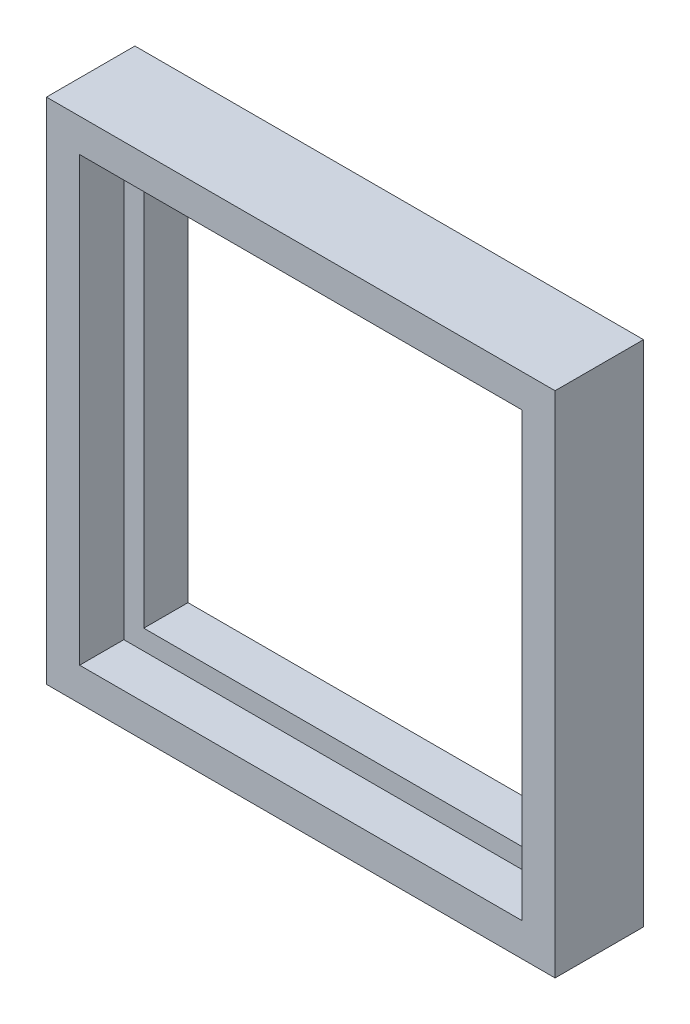
ISO-10303-21;
HEADER;
FILE_DESCRIPTION(('STEP AP214'),'2;1');
FILE_NAME('part.step','',(''),(''),'','','');
FILE_SCHEMA(('AUTOMOTIVE_DESIGN { 1 0 10303 214 1 1 1 1 }'));
ENDSEC;
DATA;
#1=APPLICATION_CONTEXT('core data for automotive mechanical design processes');
#2=APPLICATION_PROTOCOL_DEFINITION('international standard','automotive_design',2000,#1);
#3=PRODUCT_CONTEXT('',#1,'mechanical');
#4=PRODUCT('Part','Part','',(#3));
#5=PRODUCT_RELATED_PRODUCT_CATEGORY('part','',(#4));
#6=PRODUCT_DEFINITION_FORMATION('','',#4);
#7=PRODUCT_DEFINITION_CONTEXT('part definition',#1,'design');
#8=PRODUCT_DEFINITION('design','',#6,#7);
#9=PRODUCT_DEFINITION_SHAPE('','',#8);
#10=(LENGTH_UNIT() NAMED_UNIT(*) SI_UNIT(.MILLI.,.METRE.));
#11=(NAMED_UNIT(*) PLANE_ANGLE_UNIT() SI_UNIT($,.RADIAN.));
#12=(NAMED_UNIT(*) SI_UNIT($,.STERADIAN.) SOLID_ANGLE_UNIT());
#13=UNCERTAINTY_MEASURE_WITH_UNIT(LENGTH_MEASURE(1.E-05),#10,'distance_accuracy_value','');
#14=(GEOMETRIC_REPRESENTATION_CONTEXT(3) GLOBAL_UNCERTAINTY_ASSIGNED_CONTEXT((#13)) GLOBAL_UNIT_ASSIGNED_CONTEXT((#10,
#11,#12)) REPRESENTATION_CONTEXT('',''));
#15=CARTESIAN_POINT('',(0.,0.,0.));
#16=DIRECTION('',(0.,0.,1.));
#17=DIRECTION('',(1.,0.,0.));
#18=AXIS2_PLACEMENT_3D('',#15,#16,#17);
#19=CARTESIAN_POINT('',(0.,0.,1.));
#20=DIRECTION('',(0.,0.,-1.));
#21=DIRECTION('',(-1.,0.,0.));
#22=AXIS2_PLACEMENT_3D('',#19,#20,#21);
#23=PLANE('',#22);
#24=DIRECTION('',(0.,1.,0.));
#25=VECTOR('',#24,1.);
#26=CARTESIAN_POINT('',(5.75,-5.75,1.));
#27=LINE('',#26,#25);
#28=CARTESIAN_POINT('',(5.75,-5.75,1.));
#29=VERTEX_POINT('',#28);
#30=CARTESIAN_POINT('',(5.75,5.75,1.));
#31=VERTEX_POINT('',#30);
#32=EDGE_CURVE('E203',#29,#31,#27,.T.);
#33=ORIENTED_EDGE('',*,*,#32,.T.);
#34=DIRECTION('',(-1.,0.,0.));
#35=VECTOR('',#34,1.);
#36=CARTESIAN_POINT('',(-5.75,5.75,1.));
#37=LINE('',#36,#35);
#38=CARTESIAN_POINT('',(-5.75,5.75,1.));
#39=VERTEX_POINT('',#38);
#40=EDGE_CURVE('E206',#31,#39,#37,.T.);
#41=ORIENTED_EDGE('',*,*,#40,.T.);
#42=DIRECTION('',(0.,-1.,0.));
#43=VECTOR('',#42,1.);
#44=CARTESIAN_POINT('',(-5.75,-5.75,1.));
#45=LINE('',#44,#43);
#46=CARTESIAN_POINT('',(-5.75,-5.75,1.));
#47=VERTEX_POINT('',#46);
#48=EDGE_CURVE('E208',#39,#47,#45,.T.);
#49=ORIENTED_EDGE('',*,*,#48,.T.);
#50=DIRECTION('',(1.,0.,0.));
#51=VECTOR('',#50,1.);
#52=CARTESIAN_POINT('',(-5.75,-5.75,1.));
#53=LINE('',#52,#51);
#54=EDGE_CURVE('E210',#47,#29,#53,.T.);
#55=ORIENTED_EDGE('',*,*,#54,.T.);
#56=EDGE_LOOP('',(#33,#41,#49,#55));
#57=FACE_BOUND('',#56,.T.);
#58=DIRECTION('',(0.,1.,0.));
#59=VECTOR('',#58,1.);
#60=CARTESIAN_POINT('',(5.,-5.,1.));
#61=LINE('',#60,#59);
#62=CARTESIAN_POINT('',(5.,-5.,1.));
#63=VERTEX_POINT('',#62);
#64=CARTESIAN_POINT('',(5.,5.,1.));
#65=VERTEX_POINT('',#64);
#66=EDGE_CURVE('E178',#63,#65,#61,.T.);
#67=ORIENTED_EDGE('',*,*,#66,.F.);
#68=DIRECTION('',(1.,0.,0.));
#69=VECTOR('',#68,1.);
#70=CARTESIAN_POINT('',(-5.,-5.,1.));
#71=LINE('',#70,#69);
#72=CARTESIAN_POINT('',(-5.,-5.,1.));
#73=VERTEX_POINT('',#72);
#74=EDGE_CURVE('E185',#73,#63,#71,.T.);
#75=ORIENTED_EDGE('',*,*,#74,.F.);
#76=DIRECTION('',(0.,-1.,0.));
#77=VECTOR('',#76,1.);
#78=CARTESIAN_POINT('',(-5.,-5.,1.));
#79=LINE('',#78,#77);
#80=CARTESIAN_POINT('',(-5.,5.,1.));
#81=VERTEX_POINT('',#80);
#82=EDGE_CURVE('E183',#81,#73,#79,.T.);
#83=ORIENTED_EDGE('',*,*,#82,.F.);
#84=DIRECTION('',(-1.,0.,0.));
#85=VECTOR('',#84,1.);
#86=CARTESIAN_POINT('',(-5.,5.,1.));
#87=LINE('',#86,#85);
#88=EDGE_CURVE('E180',#65,#81,#87,.T.);
#89=ORIENTED_EDGE('',*,*,#88,.F.);
#90=EDGE_LOOP('',(#67,#75,#83,#89));
#91=FACE_BOUND('',#90,.T.);
#92=ADVANCED_FACE('F34',(#57,#91),#23,.F.);
#93=CARTESIAN_POINT('',(5.75,-5.75,1.));
#94=DIRECTION('',(-1.,0.,0.));
#95=DIRECTION('',(0.,0.,1.));
#96=AXIS2_PLACEMENT_3D('',#93,#94,#95);
#97=PLANE('',#96);
#98=DIRECTION('',(0.,0.,-1.));
#99=VECTOR('',#98,1.);
#100=CARTESIAN_POINT('',(5.75,-5.75,1.));
#101=LINE('',#100,#99);
#102=CARTESIAN_POINT('',(5.75,-5.75,-1.));
#103=VERTEX_POINT('',#102);
#104=EDGE_CURVE('E212',#29,#103,#101,.T.);
#105=ORIENTED_EDGE('',*,*,#104,.T.);
#106=DIRECTION('',(0.,-1.,0.));
#107=VECTOR('',#106,1.);
#108=CARTESIAN_POINT('',(5.75,5.75,-1.));
#109=LINE('',#108,#107);
#110=CARTESIAN_POINT('',(5.75,5.75,-1.));
#111=VERTEX_POINT('',#110);
#112=EDGE_CURVE('E169',#111,#103,#109,.T.);
#113=ORIENTED_EDGE('',*,*,#112,.F.);
#114=DIRECTION('',(0.,0.,-1.));
#115=VECTOR('',#114,1.);
#116=CARTESIAN_POINT('',(5.75,5.75,1.));
#117=LINE('',#116,#115);
#118=EDGE_CURVE('E11',#31,#111,#117,.T.);
#119=ORIENTED_EDGE('',*,*,#118,.F.);
#120=ORIENTED_EDGE('',*,*,#32,.F.);
#121=EDGE_LOOP('',(#105,#113,#119,#120));
#122=FACE_BOUND('',#121,.T.);
#123=ADVANCED_FACE('F36',(#122),#97,.F.);
#124=CARTESIAN_POINT('',(-5.75,5.75,1.));
#125=DIRECTION('',(0.,-1.,0.));
#126=DIRECTION('',(0.,0.,-1.));
#127=AXIS2_PLACEMENT_3D('',#124,#125,#126);
#128=PLANE('',#127);
#129=ORIENTED_EDGE('',*,*,#118,.T.);
#130=DIRECTION('',(1.,0.,0.));
#131=VECTOR('',#130,1.);
#132=CARTESIAN_POINT('',(-5.75,5.75,-1.));
#133=LINE('',#132,#131);
#134=CARTESIAN_POINT('',(-5.75,5.75,-1.));
#135=VERTEX_POINT('',#134);
#136=EDGE_CURVE('E143',#135,#111,#133,.T.);
#137=ORIENTED_EDGE('',*,*,#136,.F.);
#138=DIRECTION('',(0.,0.,-1.));
#139=VECTOR('',#138,1.);
#140=CARTESIAN_POINT('',(-5.75,5.75,1.));
#141=LINE('',#140,#139);
#142=EDGE_CURVE('E42',#39,#135,#141,.T.);
#143=ORIENTED_EDGE('',*,*,#142,.F.);
#144=ORIENTED_EDGE('',*,*,#40,.F.);
#145=EDGE_LOOP('',(#129,#137,#143,#144));
#146=FACE_BOUND('',#145,.T.);
#147=ADVANCED_FACE('F225',(#146),#128,.F.);
#148=CARTESIAN_POINT('',(-5.75,-5.75,1.));
#149=DIRECTION('',(1.,0.,0.));
#150=DIRECTION('',(0.,0.,-1.));
#151=AXIS2_PLACEMENT_3D('',#148,#149,#150);
#152=PLANE('',#151);
#153=ORIENTED_EDGE('',*,*,#142,.T.);
#154=DIRECTION('',(0.,1.,0.));
#155=VECTOR('',#154,1.);
#156=CARTESIAN_POINT('',(-5.75,-5.75,-1.));
#157=LINE('',#156,#155);
#158=CARTESIAN_POINT('',(-5.75,-5.75,-1.));
#159=VERTEX_POINT('',#158);
#160=EDGE_CURVE('E175',#159,#135,#157,.T.);
#161=ORIENTED_EDGE('',*,*,#160,.F.);
#162=DIRECTION('',(0.,0.,-1.));
#163=VECTOR('',#162,1.);
#164=CARTESIAN_POINT('',(-5.75,-5.75,1.));
#165=LINE('',#164,#163);
#166=EDGE_CURVE('E214',#47,#159,#165,.T.);
#167=ORIENTED_EDGE('',*,*,#166,.F.);
#168=ORIENTED_EDGE('',*,*,#48,.F.);
#169=EDGE_LOOP('',(#153,#161,#167,#168));
#170=FACE_BOUND('',#169,.T.);
#171=ADVANCED_FACE('F219',(#170),#152,.F.);
#172=CARTESIAN_POINT('',(-5.75,-5.75,1.));
#173=DIRECTION('',(0.,1.,0.));
#174=DIRECTION('',(0.,0.,1.));
#175=AXIS2_PLACEMENT_3D('',#172,#173,#174);
#176=PLANE('',#175);
#177=ORIENTED_EDGE('',*,*,#166,.T.);
#178=DIRECTION('',(-1.,0.,0.));
#179=VECTOR('',#178,1.);
#180=CARTESIAN_POINT('',(5.75,-5.75,-1.));
#181=LINE('',#180,#179);
#182=EDGE_CURVE('E172',#103,#159,#181,.T.);
#183=ORIENTED_EDGE('',*,*,#182,.F.);
#184=ORIENTED_EDGE('',*,*,#104,.F.);
#185=ORIENTED_EDGE('',*,*,#54,.F.);
#186=EDGE_LOOP('',(#177,#183,#184,#185));
#187=FACE_BOUND('',#186,.T.);
#188=ADVANCED_FACE('F232',(#187),#176,.F.);
#189=CARTESIAN_POINT('',(5.,-5.,1.));
#190=DIRECTION('',(-1.,0.,0.));
#191=DIRECTION('',(0.,0.,1.));
#192=AXIS2_PLACEMENT_3D('',#189,#190,#191);
#193=PLANE('',#192);
#194=DIRECTION('',(0.,1.,0.));
#195=VECTOR('',#194,1.);
#196=CARTESIAN_POINT('',(5.,-5.,0.));
#197=LINE('',#196,#195);
#198=CARTESIAN_POINT('',(5.,-5.,0.));
#199=VERTEX_POINT('',#198);
#200=CARTESIAN_POINT('',(5.,5.,0.));
#201=VERTEX_POINT('',#200);
#202=EDGE_CURVE('E57',#199,#201,#197,.T.);
#203=ORIENTED_EDGE('',*,*,#202,.F.);
#204=DIRECTION('',(0.,0.,-1.));
#205=VECTOR('',#204,1.);
#206=CARTESIAN_POINT('',(5.,-5.,1.));
#207=LINE('',#206,#205);
#208=EDGE_CURVE('E187',#63,#199,#207,.T.);
#209=ORIENTED_EDGE('',*,*,#208,.F.);
#210=ORIENTED_EDGE('',*,*,#66,.T.);
#211=DIRECTION('',(0.,0.,-1.));
#212=VECTOR('',#211,1.);
#213=CARTESIAN_POINT('',(5.,5.,1.));
#214=LINE('',#213,#212);
#215=EDGE_CURVE('E201',#65,#201,#214,.T.);
#216=ORIENTED_EDGE('',*,*,#215,.T.);
#217=EDGE_LOOP('',(#203,#209,#210,#216));
#218=FACE_BOUND('',#217,.T.);
#219=ADVANCED_FACE('F243',(#218),#193,.T.);
#220=CARTESIAN_POINT('',(-5.,5.,1.));
#221=DIRECTION('',(0.,-1.,0.));
#222=DIRECTION('',(0.,0.,-1.));
#223=AXIS2_PLACEMENT_3D('',#220,#221,#222);
#224=PLANE('',#223);
#225=DIRECTION('',(-1.,0.,0.));
#226=VECTOR('',#225,1.);
#227=CARTESIAN_POINT('',(-5.,5.,0.));
#228=LINE('',#227,#226);
#229=CARTESIAN_POINT('',(-5.,5.,0.));
#230=VERTEX_POINT('',#229);
#231=EDGE_CURVE('E189',#201,#230,#228,.T.);
#232=ORIENTED_EDGE('',*,*,#231,.F.);
#233=ORIENTED_EDGE('',*,*,#215,.F.);
#234=ORIENTED_EDGE('',*,*,#88,.T.);
#235=DIRECTION('',(0.,0.,-1.));
#236=VECTOR('',#235,1.);
#237=CARTESIAN_POINT('',(-5.,5.,1.));
#238=LINE('',#237,#236);
#239=EDGE_CURVE('E199',#81,#230,#238,.T.);
#240=ORIENTED_EDGE('',*,*,#239,.T.);
#241=EDGE_LOOP('',(#232,#233,#234,#240));
#242=FACE_BOUND('',#241,.T.);
#243=ADVANCED_FACE('F245',(#242),#224,.T.);
#244=CARTESIAN_POINT('',(-5.,-5.,1.));
#245=DIRECTION('',(1.,0.,0.));
#246=DIRECTION('',(0.,0.,-1.));
#247=AXIS2_PLACEMENT_3D('',#244,#245,#246);
#248=PLANE('',#247);
#249=DIRECTION('',(0.,-1.,0.));
#250=VECTOR('',#249,1.);
#251=CARTESIAN_POINT('',(-5.,-5.,0.));
#252=LINE('',#251,#250);
#253=CARTESIAN_POINT('',(-5.,-5.,0.));
#254=VERTEX_POINT('',#253);
#255=EDGE_CURVE('E192',#230,#254,#252,.T.);
#256=ORIENTED_EDGE('',*,*,#255,.F.);
#257=ORIENTED_EDGE('',*,*,#239,.F.);
#258=ORIENTED_EDGE('',*,*,#82,.T.);
#259=DIRECTION('',(0.,0.,-1.));
#260=VECTOR('',#259,1.);
#261=CARTESIAN_POINT('',(-5.,-5.,1.));
#262=LINE('',#261,#260);
#263=EDGE_CURVE('E49',#73,#254,#262,.T.);
#264=ORIENTED_EDGE('',*,*,#263,.T.);
#265=EDGE_LOOP('',(#256,#257,#258,#264));
#266=FACE_BOUND('',#265,.T.);
#267=ADVANCED_FACE('F252',(#266),#248,.T.);
#268=CARTESIAN_POINT('',(-5.,-5.,1.));
#269=DIRECTION('',(0.,1.,0.));
#270=DIRECTION('',(0.,0.,1.));
#271=AXIS2_PLACEMENT_3D('',#268,#269,#270);
#272=PLANE('',#271);
#273=DIRECTION('',(1.,0.,0.));
#274=VECTOR('',#273,1.);
#275=CARTESIAN_POINT('',(-5.,-5.,0.));
#276=LINE('',#275,#274);
#277=EDGE_CURVE('E181',#254,#199,#276,.T.);
#278=ORIENTED_EDGE('',*,*,#277,.F.);
#279=ORIENTED_EDGE('',*,*,#263,.F.);
#280=ORIENTED_EDGE('',*,*,#74,.T.);
#281=ORIENTED_EDGE('',*,*,#208,.T.);
#282=EDGE_LOOP('',(#278,#279,#280,#281));
#283=FACE_BOUND('',#282,.T.);
#284=ADVANCED_FACE('F250',(#283),#272,.T.);
#285=CARTESIAN_POINT('',(0.,0.,0.));
#286=DIRECTION('',(0.,0.,-1.));
#287=DIRECTION('',(-1.,0.,0.));
#288=AXIS2_PLACEMENT_3D('',#285,#286,#287);
#289=PLANE('',#288);
#290=DIRECTION('',(0.,-1.,0.));
#291=VECTOR('',#290,1.);
#292=CARTESIAN_POINT('',(4.55,4.55,0.));
#293=LINE('',#292,#291);
#294=CARTESIAN_POINT('',(4.55,4.55,0.));
#295=VERTEX_POINT('',#294);
#296=CARTESIAN_POINT('',(4.55,-4.55,0.));
#297=VERTEX_POINT('',#296);
#298=EDGE_CURVE('E155',#295,#297,#293,.T.);
#299=ORIENTED_EDGE('',*,*,#298,.T.);
#300=DIRECTION('',(-1.,0.,0.));
#301=VECTOR('',#300,1.);
#302=CARTESIAN_POINT('',(4.55,-4.55,0.));
#303=LINE('',#302,#301);
#304=CARTESIAN_POINT('',(-4.55,-4.55,0.));
#305=VERTEX_POINT('',#304);
#306=EDGE_CURVE('E142',#297,#305,#303,.T.);
#307=ORIENTED_EDGE('',*,*,#306,.T.);
#308=DIRECTION('',(0.,1.,0.));
#309=VECTOR('',#308,1.);
#310=CARTESIAN_POINT('',(-4.55,-4.55,0.));
#311=LINE('',#310,#309);
#312=CARTESIAN_POINT('',(-4.55,4.55,0.));
#313=VERTEX_POINT('',#312);
#314=EDGE_CURVE('E158',#305,#313,#311,.T.);
#315=ORIENTED_EDGE('',*,*,#314,.T.);
#316=DIRECTION('',(1.,0.,0.));
#317=VECTOR('',#316,1.);
#318=CARTESIAN_POINT('',(-4.55,4.55,0.));
#319=LINE('',#318,#317);
#320=EDGE_CURVE('E136',#313,#295,#319,.T.);
#321=ORIENTED_EDGE('',*,*,#320,.T.);
#322=EDGE_LOOP('',(#299,#307,#315,#321));
#323=FACE_BOUND('',#322,.T.);
#324=ORIENTED_EDGE('',*,*,#255,.T.);
#325=ORIENTED_EDGE('',*,*,#277,.T.);
#326=ORIENTED_EDGE('',*,*,#202,.T.);
#327=ORIENTED_EDGE('',*,*,#231,.T.);
#328=EDGE_LOOP('',(#324,#325,#326,#327));
#329=FACE_BOUND('',#328,.T.);
#330=ADVANCED_FACE('F249',(#323,#329),#289,.F.);
#331=CARTESIAN_POINT('',(0.,0.,-1.));
#332=DIRECTION('',(0.,0.,-1.));
#333=DIRECTION('',(-1.,0.,0.));
#334=AXIS2_PLACEMENT_3D('',#331,#332,#333);
#335=PLANE('',#334);
#336=ORIENTED_EDGE('',*,*,#136,.T.);
#337=ORIENTED_EDGE('',*,*,#112,.T.);
#338=ORIENTED_EDGE('',*,*,#182,.T.);
#339=ORIENTED_EDGE('',*,*,#160,.T.);
#340=EDGE_LOOP('',(#336,#337,#338,#339));
#341=FACE_BOUND('',#340,.T.);
#342=DIRECTION('',(-1.,0.,0.));
#343=VECTOR('',#342,1.);
#344=CARTESIAN_POINT('',(4.55,-4.55,-1.));
#345=LINE('',#344,#343);
#346=CARTESIAN_POINT('',(4.55,-4.55,-1.));
#347=VERTEX_POINT('',#346);
#348=CARTESIAN_POINT('',(-4.55,-4.55,-1.));
#349=VERTEX_POINT('',#348);
#350=EDGE_CURVE('E135',#347,#349,#345,.T.);
#351=ORIENTED_EDGE('',*,*,#350,.F.);
#352=DIRECTION('',(0.,-1.,0.));
#353=VECTOR('',#352,1.);
#354=CARTESIAN_POINT('',(4.55,4.55,-1.));
#355=LINE('',#354,#353);
#356=CARTESIAN_POINT('',(4.55,4.55,-1.));
#357=VERTEX_POINT('',#356);
#358=EDGE_CURVE('E125',#357,#347,#355,.T.);
#359=ORIENTED_EDGE('',*,*,#358,.F.);
#360=DIRECTION('',(1.,0.,0.));
#361=VECTOR('',#360,1.);
#362=CARTESIAN_POINT('',(-4.55,4.55,-1.));
#363=LINE('',#362,#361);
#364=CARTESIAN_POINT('',(-4.55,4.55,-1.));
#365=VERTEX_POINT('',#364);
#366=EDGE_CURVE('E151',#365,#357,#363,.T.);
#367=ORIENTED_EDGE('',*,*,#366,.F.);
#368=DIRECTION('',(0.,1.,0.));
#369=VECTOR('',#368,1.);
#370=CARTESIAN_POINT('',(-4.55,-4.55,-1.));
#371=LINE('',#370,#369);
#372=EDGE_CURVE('E149',#349,#365,#371,.T.);
#373=ORIENTED_EDGE('',*,*,#372,.F.);
#374=EDGE_LOOP('',(#351,#359,#367,#373));
#375=FACE_BOUND('',#374,.T.);
#376=ADVANCED_FACE('F147',(#341,#375),#335,.T.);
#377=CARTESIAN_POINT('',(4.55,4.55,-1.));
#378=DIRECTION('',(-1.,0.,0.));
#379=DIRECTION('',(0.,-1.,0.));
#380=AXIS2_PLACEMENT_3D('',#377,#378,#379);
#381=PLANE('',#380);
#382=ORIENTED_EDGE('',*,*,#298,.F.);
#383=DIRECTION('',(0.,0.,1.));
#384=VECTOR('',#383,1.);
#385=CARTESIAN_POINT('',(4.55,4.55,-1.));
#386=LINE('',#385,#384);
#387=EDGE_CURVE('E131',#357,#295,#386,.T.);
#388=ORIENTED_EDGE('',*,*,#387,.F.);
#389=ORIENTED_EDGE('',*,*,#358,.T.);
#390=DIRECTION('',(0.,0.,1.));
#391=VECTOR('',#390,1.);
#392=CARTESIAN_POINT('',(4.55,-4.55,-1.));
#393=LINE('',#392,#391);
#394=EDGE_CURVE('E128',#347,#297,#393,.T.);
#395=ORIENTED_EDGE('',*,*,#394,.T.);
#396=EDGE_LOOP('',(#382,#388,#389,#395));
#397=FACE_BOUND('',#396,.T.);
#398=ADVANCED_FACE('F127',(#397),#381,.T.);
#399=CARTESIAN_POINT('',(4.55,-4.55,-1.));
#400=DIRECTION('',(0.,1.,0.));
#401=DIRECTION('',(-1.,0.,0.));
#402=AXIS2_PLACEMENT_3D('',#399,#400,#401);
#403=PLANE('',#402);
#404=ORIENTED_EDGE('',*,*,#306,.F.);
#405=ORIENTED_EDGE('',*,*,#394,.F.);
#406=ORIENTED_EDGE('',*,*,#350,.T.);
#407=DIRECTION('',(0.,0.,1.));
#408=VECTOR('',#407,1.);
#409=CARTESIAN_POINT('',(-4.55,-4.55,-1.));
#410=LINE('',#409,#408);
#411=EDGE_CURVE('E144',#349,#305,#410,.T.);
#412=ORIENTED_EDGE('',*,*,#411,.T.);
#413=EDGE_LOOP('',(#404,#405,#406,#412));
#414=FACE_BOUND('',#413,.T.);
#415=ADVANCED_FACE('F139',(#414),#403,.T.);
#416=CARTESIAN_POINT('',(-4.55,-4.55,-1.));
#417=DIRECTION('',(1.,0.,0.));
#418=DIRECTION('',(0.,0.,-1.));
#419=AXIS2_PLACEMENT_3D('',#416,#417,#418);
#420=PLANE('',#419);
#421=ORIENTED_EDGE('',*,*,#314,.F.);
#422=ORIENTED_EDGE('',*,*,#411,.F.);
#423=ORIENTED_EDGE('',*,*,#372,.T.);
#424=DIRECTION('',(0.,0.,1.));
#425=VECTOR('',#424,1.);
#426=CARTESIAN_POINT('',(-4.55,4.55,-1.));
#427=LINE('',#426,#425);
#428=EDGE_CURVE('E164',#365,#313,#427,.T.);
#429=ORIENTED_EDGE('',*,*,#428,.T.);
#430=EDGE_LOOP('',(#421,#422,#423,#429));
#431=FACE_BOUND('',#430,.T.);
#432=ADVANCED_FACE('F356',(#431),#420,.T.);
#433=CARTESIAN_POINT('',(-4.55,4.55,-1.));
#434=DIRECTION('',(0.,-1.,0.));
#435=DIRECTION('',(1.,0.,0.));
#436=AXIS2_PLACEMENT_3D('',#433,#434,#435);
#437=PLANE('',#436);
#438=ORIENTED_EDGE('',*,*,#320,.F.);
#439=ORIENTED_EDGE('',*,*,#428,.F.);
#440=ORIENTED_EDGE('',*,*,#366,.T.);
#441=ORIENTED_EDGE('',*,*,#387,.T.);
#442=EDGE_LOOP('',(#438,#439,#440,#441));
#443=FACE_BOUND('',#442,.T.);
#444=ADVANCED_FACE('F365',(#443),#437,.T.);
#445=CLOSED_SHELL('',(#92,#123,#147,#171,#188,#219,#243,#267,#284,#330,#376,#398,#415,#432,#444));
#446=MANIFOLD_SOLID_BREP('B2',#445);
#447=ADVANCED_BREP_SHAPE_REPRESENTATION('',(#18,#446),#14);
#448=SHAPE_DEFINITION_REPRESENTATION(#9,#447);
ENDSEC;
END-ISO-10303-21;
